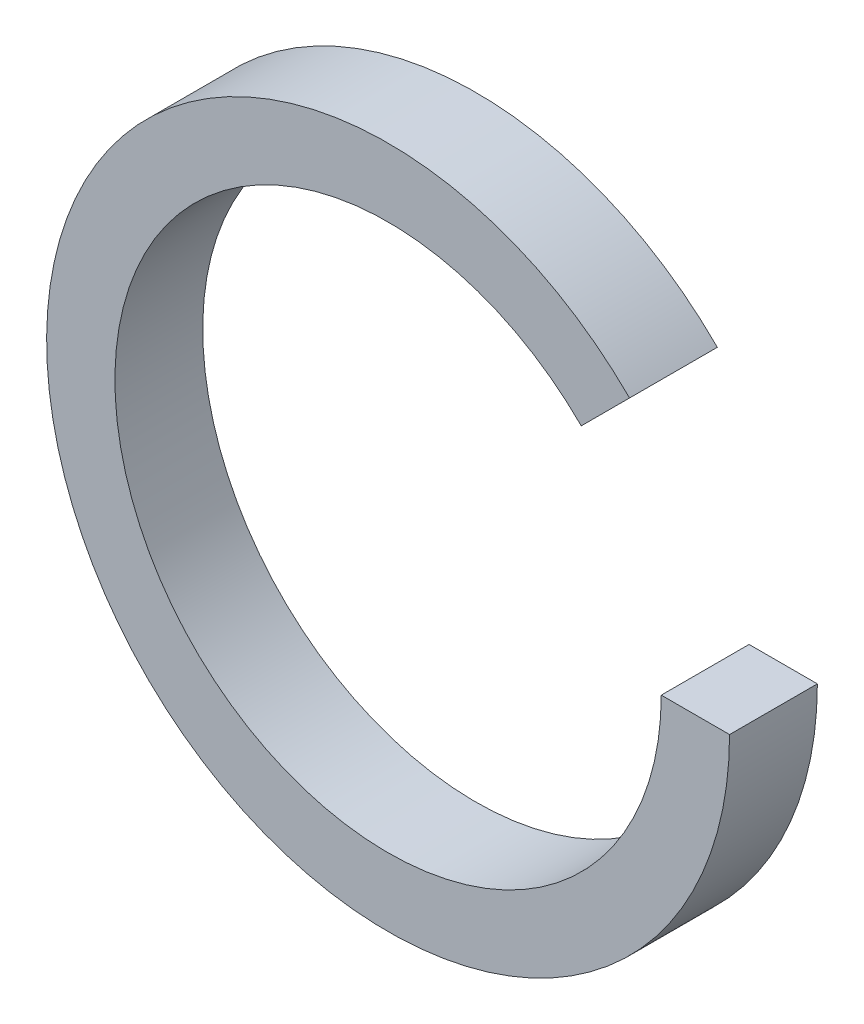
ISO-10303-21;
HEADER;
FILE_DESCRIPTION(('STEP AP214'),'2;1');
FILE_NAME('part.step','',(''),(''),'','','');
FILE_SCHEMA(('AUTOMOTIVE_DESIGN { 1 0 10303 214 1 1 1 1 }'));
ENDSEC;
DATA;
#1=APPLICATION_CONTEXT('core data for automotive mechanical design processes');
#2=APPLICATION_PROTOCOL_DEFINITION('international standard','automotive_design',2000,#1);
#3=PRODUCT_CONTEXT('',#1,'mechanical');
#4=PRODUCT('Part','Part','',(#3));
#5=PRODUCT_RELATED_PRODUCT_CATEGORY('part','',(#4));
#6=PRODUCT_DEFINITION_FORMATION('','',#4);
#7=PRODUCT_DEFINITION_CONTEXT('part definition',#1,'design');
#8=PRODUCT_DEFINITION('design','',#6,#7);
#9=PRODUCT_DEFINITION_SHAPE('','',#8);
#10=(LENGTH_UNIT() NAMED_UNIT(*) SI_UNIT(.MILLI.,.METRE.));
#11=(NAMED_UNIT(*) PLANE_ANGLE_UNIT() SI_UNIT($,.RADIAN.));
#12=(NAMED_UNIT(*) SI_UNIT($,.STERADIAN.) SOLID_ANGLE_UNIT());
#13=UNCERTAINTY_MEASURE_WITH_UNIT(LENGTH_MEASURE(1.E-05),#10,'distance_accuracy_value','');
#14=(GEOMETRIC_REPRESENTATION_CONTEXT(3) GLOBAL_UNCERTAINTY_ASSIGNED_CONTEXT((#13)) GLOBAL_UNIT_ASSIGNED_CONTEXT((#10,
#11,#12)) REPRESENTATION_CONTEXT('',''));
#15=CARTESIAN_POINT('',(0.,0.,0.));
#16=DIRECTION('',(0.,0.,1.));
#17=DIRECTION('',(1.,0.,0.));
#18=AXIS2_PLACEMENT_3D('',#15,#16,#17);
#19=CARTESIAN_POINT('',(0.,0.,0.95678));
#20=DIRECTION('',(0.,0.,1.));
#21=DIRECTION('',(0.,-1.,0.));
#22=AXIS2_PLACEMENT_3D('',#19,#20,#21);
#23=CYLINDRICAL_SURFACE('',#22,2.8);
#24=DIRECTION('',(0.,0.,1.));
#25=VECTOR('',#24,1.);
#26=CARTESIAN_POINT('',(1.979898987322,1.979898987322,1.40678));
#27=LINE('',#26,#25);
#28=CARTESIAN_POINT('',(1.97989898732217,1.97989898732217,0.95678));
#29=VERTEX_POINT('',#28);
#30=CARTESIAN_POINT('',(1.97989898732217,1.97989898732217,1.85678));
#31=VERTEX_POINT('',#30);
#32=EDGE_CURVE('E74',#29,#31,#27,.T.);
#33=ORIENTED_EDGE('',*,*,#32,.T.);
#34=CARTESIAN_POINT('',(0.,0.,1.85678));
#35=DIRECTION('',(0.,0.,1.));
#36=DIRECTION('',(0.,-1.,0.));
#37=AXIS2_PLACEMENT_3D('',#34,#35,#36);
#38=CIRCLE('',#37,2.8);
#39=CARTESIAN_POINT('',(2.8,0.,1.85678));
#40=VERTEX_POINT('',#39);
#41=EDGE_CURVE('E28',#31,#40,#38,.T.);
#42=ORIENTED_EDGE('',*,*,#41,.T.);
#43=DIRECTION('',(0.,0.,1.));
#44=VECTOR('',#43,1.);
#45=CARTESIAN_POINT('',(2.8,0.,0.95678));
#46=LINE('',#45,#44);
#47=CARTESIAN_POINT('',(2.8,0.,0.95678));
#48=VERTEX_POINT('',#47);
#49=EDGE_CURVE('E72',#48,#40,#46,.T.);
#50=ORIENTED_EDGE('',*,*,#49,.F.);
#51=CARTESIAN_POINT('',(0.,0.,0.95678));
#52=DIRECTION('',(0.,0.,1.));
#53=DIRECTION('',(0.,-1.,0.));
#54=AXIS2_PLACEMENT_3D('',#51,#52,#53);
#55=CIRCLE('',#54,2.8);
#56=EDGE_CURVE('E75',#29,#48,#55,.T.);
#57=ORIENTED_EDGE('',*,*,#56,.F.);
#58=EDGE_LOOP('',(#33,#42,#50,#57));
#59=FACE_BOUND('',#58,.T.);
#60=ADVANCED_FACE('F25',(#59),#23,.F.);
#61=CARTESIAN_POINT('',(0.,0.,1.85678));
#62=DIRECTION('',(0.,0.,-1.));
#63=DIRECTION('',(0.,1.,0.));
#64=AXIS2_PLACEMENT_3D('',#61,#62,#63);
#65=PLANE('',#64);
#66=DIRECTION('',(-0.707106781186548,-0.707106781186548,0.));
#67=VECTOR('',#66,1.);
#68=CARTESIAN_POINT('',(2.227386360738,2.227386360738,1.85678));
#69=LINE('',#68,#67);
#70=CARTESIAN_POINT('',(2.47487373415292,2.47487373415292,1.85678));
#71=VERTEX_POINT('',#70);
#72=EDGE_CURVE('E67',#31,#71,#69,.F.);
#73=ORIENTED_EDGE('',*,*,#72,.T.);
#74=CARTESIAN_POINT('',(0.,0.,1.85678));
#75=DIRECTION('',(0.,0.,-1.));
#76=DIRECTION('',(0.,1.,0.));
#77=AXIS2_PLACEMENT_3D('',#74,#75,#76);
#78=CIRCLE('',#77,3.5);
#79=CARTESIAN_POINT('',(3.5,0.,1.85678));
#80=VERTEX_POINT('',#79);
#81=EDGE_CURVE('E92',#80,#71,#78,.T.);
#82=ORIENTED_EDGE('',*,*,#81,.F.);
#83=DIRECTION('',(1.,0.,0.));
#84=VECTOR('',#83,1.);
#85=CARTESIAN_POINT('',(3.15,0.,1.85678));
#86=LINE('',#85,#84);
#87=EDGE_CURVE('E70',#40,#80,#86,.T.);
#88=ORIENTED_EDGE('',*,*,#87,.F.);
#89=ORIENTED_EDGE('',*,*,#41,.F.);
#90=EDGE_LOOP('',(#73,#82,#88,#89));
#91=FACE_BOUND('',#90,.T.);
#92=ADVANCED_FACE('F65',(#91),#65,.F.);
#93=CARTESIAN_POINT('',(2.227386360738,2.227386360738,1.40678));
#94=DIRECTION('',(-0.707106781186548,0.707106781186548,0.));
#95=DIRECTION('',(-0.707106781186548,-0.707106781186548,0.));
#96=AXIS2_PLACEMENT_3D('',#93,#94,#95);
#97=PLANE('',#96);
#98=DIRECTION('',(-0.707106781186548,-0.707106781186548,0.));
#99=VECTOR('',#98,1.);
#100=CARTESIAN_POINT('',(2.474873734153,2.474873734153,0.956780000000001));
#101=LINE('',#100,#99);
#102=CARTESIAN_POINT('',(2.47487373415292,2.47487373415292,0.95678));
#103=VERTEX_POINT('',#102);
#104=EDGE_CURVE('E78',#103,#29,#101,.T.);
#105=ORIENTED_EDGE('',*,*,#104,.F.);
#106=DIRECTION('',(0.,0.,-1.));
#107=VECTOR('',#106,1.);
#108=CARTESIAN_POINT('',(2.47487373415292,2.47487373415292,1.85678));
#109=LINE('',#108,#107);
#110=EDGE_CURVE('E82',#71,#103,#109,.T.);
#111=ORIENTED_EDGE('',*,*,#110,.F.);
#112=ORIENTED_EDGE('',*,*,#72,.F.);
#113=ORIENTED_EDGE('',*,*,#32,.F.);
#114=EDGE_LOOP('',(#105,#111,#112,#113));
#115=FACE_BOUND('',#114,.T.);
#116=ADVANCED_FACE('F80',(#115),#97,.F.);
#117=CARTESIAN_POINT('',(0.,0.,0.95678));
#118=DIRECTION('',(0.,0.,-1.));
#119=DIRECTION('',(0.,1.,0.));
#120=AXIS2_PLACEMENT_3D('',#117,#118,#119);
#121=PLANE('',#120);
#122=ORIENTED_EDGE('',*,*,#56,.T.);
#123=DIRECTION('',(1.,0.,0.));
#124=VECTOR('',#123,1.);
#125=CARTESIAN_POINT('',(3.15,0.,0.95678));
#126=LINE('',#125,#124);
#127=CARTESIAN_POINT('',(3.5,0.,0.95678));
#128=VERTEX_POINT('',#127);
#129=EDGE_CURVE('E43',#128,#48,#126,.F.);
#130=ORIENTED_EDGE('',*,*,#129,.F.);
#131=CARTESIAN_POINT('',(0.,0.,0.956779999999999));
#132=DIRECTION('',(0.,0.,-1.));
#133=DIRECTION('',(0.,1.,0.));
#134=AXIS2_PLACEMENT_3D('',#131,#132,#133);
#135=CIRCLE('',#134,3.5);
#136=EDGE_CURVE('E34',#103,#128,#135,.F.);
#137=ORIENTED_EDGE('',*,*,#136,.F.);
#138=ORIENTED_EDGE('',*,*,#104,.T.);
#139=EDGE_LOOP('',(#122,#130,#137,#138));
#140=FACE_BOUND('',#139,.T.);
#141=ADVANCED_FACE('F100',(#140),#121,.T.);
#142=CARTESIAN_POINT('',(3.15,0.,1.40678));
#143=DIRECTION('',(0.,1.,0.));
#144=DIRECTION('',(0.,0.,1.));
#145=AXIS2_PLACEMENT_3D('',#142,#143,#144);
#146=PLANE('',#145);
#147=ORIENTED_EDGE('',*,*,#129,.T.);
#148=ORIENTED_EDGE('',*,*,#49,.T.);
#149=ORIENTED_EDGE('',*,*,#87,.T.);
#150=DIRECTION('',(0.,0.,-1.));
#151=VECTOR('',#150,1.);
#152=CARTESIAN_POINT('',(3.5,0.,1.85678));
#153=LINE('',#152,#151);
#154=EDGE_CURVE('E13',#128,#80,#153,.F.);
#155=ORIENTED_EDGE('',*,*,#154,.F.);
#156=EDGE_LOOP('',(#147,#148,#149,#155));
#157=FACE_BOUND('',#156,.T.);
#158=ADVANCED_FACE('F98',(#157),#146,.T.);
#159=CARTESIAN_POINT('',(0.,0.,1.85678));
#160=DIRECTION('',(0.,0.,-1.));
#161=DIRECTION('',(0.,1.,0.));
#162=AXIS2_PLACEMENT_3D('',#159,#160,#161);
#163=CYLINDRICAL_SURFACE('',#162,3.5);
#164=ORIENTED_EDGE('',*,*,#136,.T.);
#165=ORIENTED_EDGE('',*,*,#154,.T.);
#166=ORIENTED_EDGE('',*,*,#81,.T.);
#167=ORIENTED_EDGE('',*,*,#110,.T.);
#168=EDGE_LOOP('',(#164,#165,#166,#167));
#169=FACE_BOUND('',#168,.T.);
#170=ADVANCED_FACE('F96',(#169),#163,.T.);
#171=CLOSED_SHELL('',(#60,#92,#116,#141,#158,#170));
#172=MANIFOLD_SOLID_BREP('B1',#171);
#173=ADVANCED_BREP_SHAPE_REPRESENTATION('',(#18,#172),#14);
#174=SHAPE_DEFINITION_REPRESENTATION(#9,#173);
ENDSEC;
END-ISO-10303-21;
